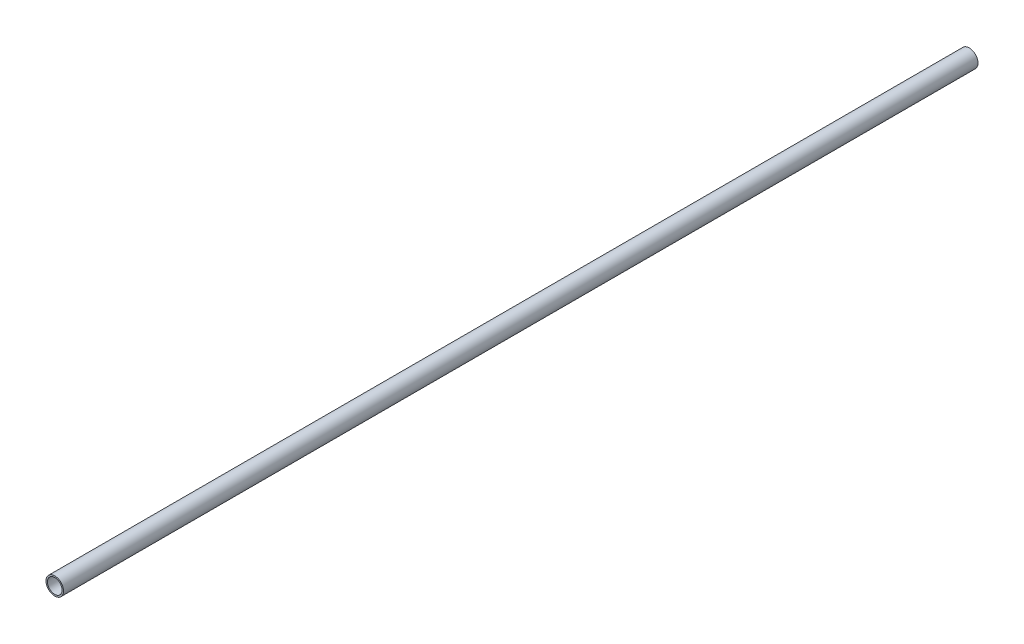
ISO-10303-21;
HEADER;
FILE_DESCRIPTION(('STEP AP214'),'2;1');
FILE_NAME('part.step','',(''),(''),'','','');
FILE_SCHEMA(('AUTOMOTIVE_DESIGN { 1 0 10303 214 1 1 1 1 }'));
ENDSEC;
DATA;
#1=APPLICATION_CONTEXT('core data for automotive mechanical design processes');
#2=APPLICATION_PROTOCOL_DEFINITION('international standard','automotive_design',2000,#1);
#3=PRODUCT_CONTEXT('',#1,'mechanical');
#4=PRODUCT('Part','Part','',(#3));
#5=PRODUCT_RELATED_PRODUCT_CATEGORY('part','',(#4));
#6=PRODUCT_DEFINITION_FORMATION('','',#4);
#7=PRODUCT_DEFINITION_CONTEXT('part definition',#1,'design');
#8=PRODUCT_DEFINITION('design','',#6,#7);
#9=PRODUCT_DEFINITION_SHAPE('','',#8);
#10=(LENGTH_UNIT() NAMED_UNIT(*) SI_UNIT(.MILLI.,.METRE.));
#11=(NAMED_UNIT(*) PLANE_ANGLE_UNIT() SI_UNIT($,.RADIAN.));
#12=(NAMED_UNIT(*) SI_UNIT($,.STERADIAN.) SOLID_ANGLE_UNIT());
#13=UNCERTAINTY_MEASURE_WITH_UNIT(LENGTH_MEASURE(1.E-05),#10,'distance_accuracy_value','');
#14=(GEOMETRIC_REPRESENTATION_CONTEXT(3) GLOBAL_UNCERTAINTY_ASSIGNED_CONTEXT((#13)) GLOBAL_UNIT_ASSIGNED_CONTEXT((#10,
#11,#12)) REPRESENTATION_CONTEXT('',''));
#15=CARTESIAN_POINT('',(0.,0.,0.));
#16=DIRECTION('',(0.,0.,1.));
#17=DIRECTION('',(1.,0.,0.));
#18=AXIS2_PLACEMENT_3D('',#15,#16,#17);
#19=CARTESIAN_POINT('',(0.,0.,312.5));
#20=DIRECTION('',(0.,0.,1.));
#21=DIRECTION('',(1.,0.,0.));
#22=AXIS2_PLACEMENT_3D('',#19,#20,#21);
#23=PLANE('',#22);
#24=CARTESIAN_POINT('',(0.,0.,312.5));
#25=DIRECTION('',(0.,0.,1.));
#26=DIRECTION('',(1.,0.,0.));
#27=AXIS2_PLACEMENT_3D('',#24,#25,#26);
#28=CIRCLE('',#27,6.);
#29=CARTESIAN_POINT('',(6.,0.,312.5));
#30=VERTEX_POINT('',#29);
#31=EDGE_CURVE('E10',#30,#30,#28,.T.);
#32=ORIENTED_EDGE('',*,*,#31,.T.);
#33=EDGE_LOOP('',(#32));
#34=FACE_BOUND('',#33,.T.);
#35=CARTESIAN_POINT('',(0.,0.,312.5));
#36=DIRECTION('',(0.,0.,1.));
#37=DIRECTION('',(1.,0.,0.));
#38=AXIS2_PLACEMENT_3D('',#35,#36,#37);
#39=CIRCLE('',#38,5.);
#40=CARTESIAN_POINT('',(5.,0.,312.5));
#41=VERTEX_POINT('',#40);
#42=EDGE_CURVE('E44',#41,#41,#39,.T.);
#43=ORIENTED_EDGE('',*,*,#42,.F.);
#44=EDGE_LOOP('',(#43));
#45=FACE_BOUND('',#44,.T.);
#46=ADVANCED_FACE('F33',(#34,#45),#23,.T.);
#47=CARTESIAN_POINT('',(0.,0.,-312.5));
#48=DIRECTION('',(0.,0.,1.));
#49=DIRECTION('',(1.,0.,0.));
#50=AXIS2_PLACEMENT_3D('',#47,#48,#49);
#51=PLANE('',#50);
#52=CARTESIAN_POINT('',(0.,0.,-312.5));
#53=DIRECTION('',(0.,0.,1.));
#54=DIRECTION('',(1.,0.,0.));
#55=AXIS2_PLACEMENT_3D('',#52,#53,#54);
#56=CIRCLE('',#55,6.);
#57=CARTESIAN_POINT('',(6.,0.,-312.5));
#58=VERTEX_POINT('',#57);
#59=EDGE_CURVE('E37',#58,#58,#56,.T.);
#60=ORIENTED_EDGE('',*,*,#59,.F.);
#61=EDGE_LOOP('',(#60));
#62=FACE_BOUND('',#61,.T.);
#63=CARTESIAN_POINT('',(0.,0.,-312.5));
#64=DIRECTION('',(0.,0.,1.));
#65=DIRECTION('',(1.,0.,0.));
#66=AXIS2_PLACEMENT_3D('',#63,#64,#65);
#67=CIRCLE('',#66,5.);
#68=CARTESIAN_POINT('',(5.,0.,-312.5));
#69=VERTEX_POINT('',#68);
#70=EDGE_CURVE('E46',#69,#69,#67,.T.);
#71=ORIENTED_EDGE('',*,*,#70,.T.);
#72=EDGE_LOOP('',(#71));
#73=FACE_BOUND('',#72,.T.);
#74=ADVANCED_FACE('F56',(#62,#73),#51,.F.);
#75=CARTESIAN_POINT('',(0.,0.,312.5));
#76=DIRECTION('',(0.,0.,-1.));
#77=DIRECTION('',(-1.,0.,0.));
#78=AXIS2_PLACEMENT_3D('',#75,#76,#77);
#79=CYLINDRICAL_SURFACE('',#78,6.);
#80=ORIENTED_EDGE('',*,*,#31,.F.);
#81=EDGE_LOOP('',(#80));
#82=FACE_BOUND('',#81,.T.);
#83=ORIENTED_EDGE('',*,*,#59,.T.);
#84=EDGE_LOOP('',(#83));
#85=FACE_BOUND('',#84,.T.);
#86=ADVANCED_FACE('F35',(#82,#85),#79,.T.);
#87=CARTESIAN_POINT('',(0.,0.,312.5));
#88=DIRECTION('',(0.,0.,-1.));
#89=DIRECTION('',(-1.,0.,0.));
#90=AXIS2_PLACEMENT_3D('',#87,#88,#89);
#91=CYLINDRICAL_SURFACE('',#90,5.);
#92=ORIENTED_EDGE('',*,*,#42,.T.);
#93=EDGE_LOOP('',(#92));
#94=FACE_BOUND('',#93,.T.);
#95=ORIENTED_EDGE('',*,*,#70,.F.);
#96=EDGE_LOOP('',(#95));
#97=FACE_BOUND('',#96,.T.);
#98=ADVANCED_FACE('F52',(#94,#97),#91,.F.);
#99=CLOSED_SHELL('',(#46,#74,#86,#98));
#100=MANIFOLD_SOLID_BREP('B2',#99);
#101=ADVANCED_BREP_SHAPE_REPRESENTATION('',(#18,#100),#14);
#102=SHAPE_DEFINITION_REPRESENTATION(#9,#101);
ENDSEC;
END-ISO-10303-21;
